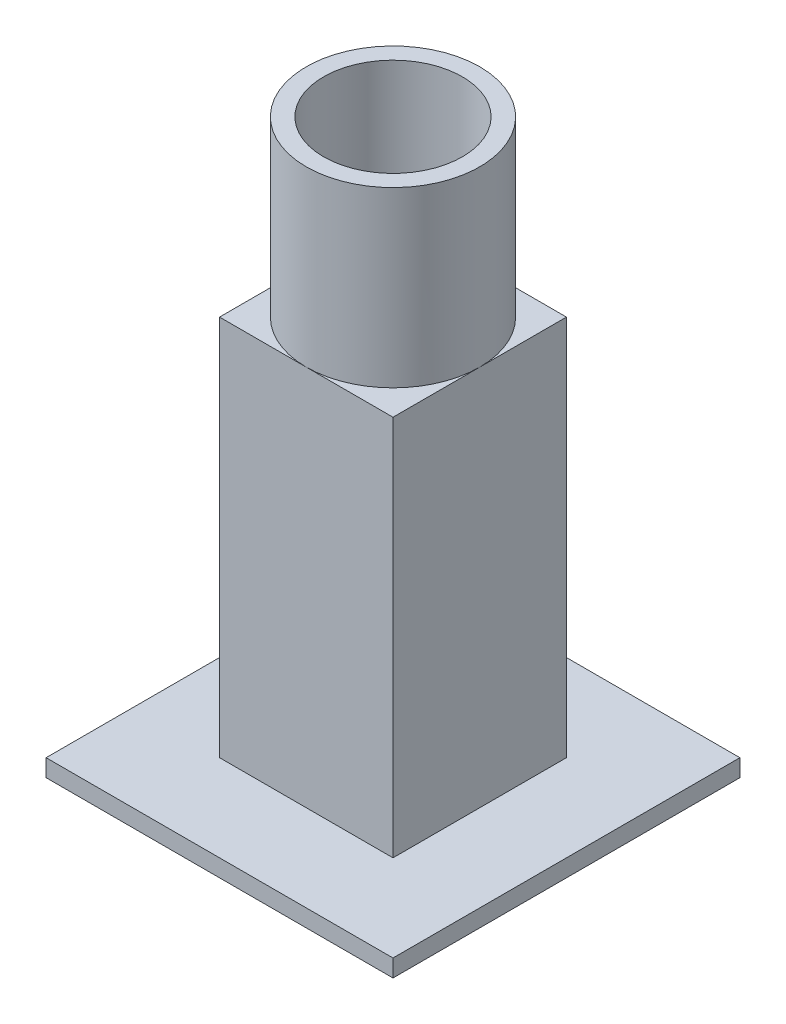
ISO-10303-21;
HEADER;
FILE_DESCRIPTION(('STEP AP214'),'2;1');
FILE_NAME('part.step','',(''),(''),'','','');
FILE_SCHEMA(('AUTOMOTIVE_DESIGN { 1 0 10303 214 1 1 1 1 }'));
ENDSEC;
DATA;
#1=APPLICATION_CONTEXT('core data for automotive mechanical design processes');
#2=APPLICATION_PROTOCOL_DEFINITION('international standard','automotive_design',2000,#1);
#3=PRODUCT_CONTEXT('',#1,'mechanical');
#4=PRODUCT('Part','Part','',(#3));
#5=PRODUCT_RELATED_PRODUCT_CATEGORY('part','',(#4));
#6=PRODUCT_DEFINITION_FORMATION('','',#4);
#7=PRODUCT_DEFINITION_CONTEXT('part definition',#1,'design');
#8=PRODUCT_DEFINITION('design','',#6,#7);
#9=PRODUCT_DEFINITION_SHAPE('','',#8);
#10=(LENGTH_UNIT() NAMED_UNIT(*) SI_UNIT(.MILLI.,.METRE.));
#11=(NAMED_UNIT(*) PLANE_ANGLE_UNIT() SI_UNIT($,.RADIAN.));
#12=(NAMED_UNIT(*) SI_UNIT($,.STERADIAN.) SOLID_ANGLE_UNIT());
#13=UNCERTAINTY_MEASURE_WITH_UNIT(LENGTH_MEASURE(1.E-05),#10,'distance_accuracy_value','');
#14=(GEOMETRIC_REPRESENTATION_CONTEXT(3) GLOBAL_UNCERTAINTY_ASSIGNED_CONTEXT((#13)) GLOBAL_UNIT_ASSIGNED_CONTEXT((#10,
#11,#12)) REPRESENTATION_CONTEXT('',''));
#15=CARTESIAN_POINT('',(0.,0.,0.));
#16=DIRECTION('',(0.,0.,1.));
#17=DIRECTION('',(1.,0.,0.));
#18=AXIS2_PLACEMENT_3D('',#15,#16,#17);
#19=CARTESIAN_POINT('',(0.,230.,0.));
#20=DIRECTION('',(0.,1.,0.));
#21=DIRECTION('',(0.,0.,1.));
#22=AXIS2_PLACEMENT_3D('',#19,#20,#21);
#23=PLANE('',#22);
#24=CARTESIAN_POINT('',(100.,230.,-100.));
#25=DIRECTION('',(0.,1.,0.));
#26=DIRECTION('',(0.,0.,1.));
#27=AXIS2_PLACEMENT_3D('',#24,#25,#26);
#28=CIRCLE('',#27,50.);
#29=CARTESIAN_POINT('',(100.,230.,-50.));
#30=VERTEX_POINT('',#29);
#31=CARTESIAN_POINT('',(150.,230.,-100.));
#32=VERTEX_POINT('',#31);
#33=EDGE_CURVE('E51',#30,#32,#28,.T.);
#34=ORIENTED_EDGE('',*,*,#33,.F.);
#35=DIRECTION('',(1.,0.,0.));
#36=VECTOR('',#35,1.);
#37=CARTESIAN_POINT('',(50.,230.,-50.));
#38=LINE('',#37,#36);
#39=CARTESIAN_POINT('',(150.,230.,-50.));
#40=VERTEX_POINT('',#39);
#41=EDGE_CURVE('E130',#30,#40,#38,.T.);
#42=ORIENTED_EDGE('',*,*,#41,.T.);
#43=DIRECTION('',(0.,0.,-1.));
#44=VECTOR('',#43,1.);
#45=CARTESIAN_POINT('',(150.,230.,-150.));
#46=LINE('',#45,#44);
#47=EDGE_CURVE('E144',#40,#32,#46,.T.);
#48=ORIENTED_EDGE('',*,*,#47,.T.);
#49=EDGE_LOOP('',(#34,#42,#48));
#50=FACE_BOUND('',#49,.T.);
#51=ADVANCED_FACE('F39',(#50),#23,.T.);
#52=CARTESIAN_POINT('',(100.,230.,-150.));
#53=VERTEX_POINT('',#52);
#54=EDGE_CURVE('E11',#32,#53,#28,.T.);
#55=ORIENTED_EDGE('',*,*,#54,.F.);
#56=CARTESIAN_POINT('',(150.,230.,-150.));
#57=VERTEX_POINT('',#56);
#58=EDGE_CURVE('E129',#32,#57,#46,.T.);
#59=ORIENTED_EDGE('',*,*,#58,.T.);
#60=DIRECTION('',(-1.,0.,0.));
#61=VECTOR('',#60,1.);
#62=CARTESIAN_POINT('',(50.,230.,-150.));
#63=LINE('',#62,#61);
#64=EDGE_CURVE('E168',#57,#53,#63,.T.);
#65=ORIENTED_EDGE('',*,*,#64,.T.);
#66=EDGE_LOOP('',(#55,#59,#65));
#67=FACE_BOUND('',#66,.T.);
#68=ADVANCED_FACE('F262',(#67),#23,.T.);
#69=CARTESIAN_POINT('',(50.,230.,-100.));
#70=VERTEX_POINT('',#69);
#71=EDGE_CURVE('E49',#53,#70,#28,.T.);
#72=ORIENTED_EDGE('',*,*,#71,.F.);
#73=CARTESIAN_POINT('',(50.,230.,-150.));
#74=VERTEX_POINT('',#73);
#75=EDGE_CURVE('E167',#53,#74,#63,.T.);
#76=ORIENTED_EDGE('',*,*,#75,.T.);
#77=DIRECTION('',(0.,0.,1.));
#78=VECTOR('',#77,1.);
#79=CARTESIAN_POINT('',(50.,230.,-150.));
#80=LINE('',#79,#78);
#81=EDGE_CURVE('E142',#74,#70,#80,.T.);
#82=ORIENTED_EDGE('',*,*,#81,.T.);
#83=EDGE_LOOP('',(#72,#76,#82));
#84=FACE_BOUND('',#83,.T.);
#85=ADVANCED_FACE('F260',(#84),#23,.T.);
#86=CARTESIAN_POINT('',(0.,10.,0.));
#87=DIRECTION('',(1.,0.,0.));
#88=DIRECTION('',(0.,0.,-1.));
#89=AXIS2_PLACEMENT_3D('',#86,#87,#88);
#90=PLANE('',#89);
#91=DIRECTION('',(0.,0.,1.));
#92=VECTOR('',#91,1.);
#93=CARTESIAN_POINT('',(0.,0.,0.));
#94=LINE('',#93,#92);
#95=CARTESIAN_POINT('',(0.,0.,-200.));
#96=VERTEX_POINT('',#95);
#97=CARTESIAN_POINT('',(0.,0.,0.));
#98=VERTEX_POINT('',#97);
#99=EDGE_CURVE('E198',#96,#98,#94,.T.);
#100=ORIENTED_EDGE('',*,*,#99,.T.);
#101=DIRECTION('',(0.,-1.,0.));
#102=VECTOR('',#101,1.);
#103=CARTESIAN_POINT('',(0.,10.,0.));
#104=LINE('',#103,#102);
#105=CARTESIAN_POINT('',(0.,10.,0.));
#106=VERTEX_POINT('',#105);
#107=EDGE_CURVE('E43',#106,#98,#104,.T.);
#108=ORIENTED_EDGE('',*,*,#107,.F.);
#109=DIRECTION('',(0.,0.,1.));
#110=VECTOR('',#109,1.);
#111=CARTESIAN_POINT('',(0.,10.,0.));
#112=LINE('',#111,#110);
#113=CARTESIAN_POINT('',(0.,10.,-200.));
#114=VERTEX_POINT('',#113);
#115=EDGE_CURVE('E199',#114,#106,#112,.T.);
#116=ORIENTED_EDGE('',*,*,#115,.F.);
#117=DIRECTION('',(0.,-1.,0.));
#118=VECTOR('',#117,1.);
#119=CARTESIAN_POINT('',(0.,10.,-200.));
#120=LINE('',#119,#118);
#121=EDGE_CURVE('E213',#114,#96,#120,.T.);
#122=ORIENTED_EDGE('',*,*,#121,.T.);
#123=EDGE_LOOP('',(#100,#108,#116,#122));
#124=FACE_BOUND('',#123,.T.);
#125=ADVANCED_FACE('F41',(#124),#90,.F.);
#126=CARTESIAN_POINT('',(0.,10.,0.));
#127=DIRECTION('',(0.,0.,-1.));
#128=DIRECTION('',(-1.,0.,0.));
#129=AXIS2_PLACEMENT_3D('',#126,#127,#128);
#130=PLANE('',#129);
#131=DIRECTION('',(1.,0.,0.));
#132=VECTOR('',#131,1.);
#133=CARTESIAN_POINT('',(0.,0.,0.));
#134=LINE('',#133,#132);
#135=CARTESIAN_POINT('',(200.,0.,0.));
#136=VERTEX_POINT('',#135);
#137=EDGE_CURVE('E217',#98,#136,#134,.T.);
#138=ORIENTED_EDGE('',*,*,#137,.T.);
#139=DIRECTION('',(0.,-1.,0.));
#140=VECTOR('',#139,1.);
#141=CARTESIAN_POINT('',(200.,10.,0.));
#142=LINE('',#141,#140);
#143=CARTESIAN_POINT('',(200.,10.,0.));
#144=VERTEX_POINT('',#143);
#145=EDGE_CURVE('E154',#144,#136,#142,.T.);
#146=ORIENTED_EDGE('',*,*,#145,.F.);
#147=DIRECTION('',(1.,0.,0.));
#148=VECTOR('',#147,1.);
#149=CARTESIAN_POINT('',(0.,10.,0.));
#150=LINE('',#149,#148);
#151=EDGE_CURVE('E203',#106,#144,#150,.T.);
#152=ORIENTED_EDGE('',*,*,#151,.F.);
#153=ORIENTED_EDGE('',*,*,#107,.T.);
#154=EDGE_LOOP('',(#138,#146,#152,#153));
#155=FACE_BOUND('',#154,.T.);
#156=ADVANCED_FACE('F253',(#155),#130,.F.);
#157=CARTESIAN_POINT('',(200.,10.,0.));
#158=DIRECTION('',(-1.,0.,0.));
#159=DIRECTION('',(0.,0.,1.));
#160=AXIS2_PLACEMENT_3D('',#157,#158,#159);
#161=PLANE('',#160);
#162=DIRECTION('',(0.,0.,-1.));
#163=VECTOR('',#162,1.);
#164=CARTESIAN_POINT('',(200.,0.,0.));
#165=LINE('',#164,#163);
#166=CARTESIAN_POINT('',(200.,0.,-200.));
#167=VERTEX_POINT('',#166);
#168=EDGE_CURVE('E220',#136,#167,#165,.T.);
#169=ORIENTED_EDGE('',*,*,#168,.T.);
#170=DIRECTION('',(0.,-1.,0.));
#171=VECTOR('',#170,1.);
#172=CARTESIAN_POINT('',(200.,10.,-200.));
#173=LINE('',#172,#171);
#174=CARTESIAN_POINT('',(200.,10.,-200.));
#175=VERTEX_POINT('',#174);
#176=EDGE_CURVE('E228',#175,#167,#173,.T.);
#177=ORIENTED_EDGE('',*,*,#176,.F.);
#178=DIRECTION('',(0.,0.,-1.));
#179=VECTOR('',#178,1.);
#180=CARTESIAN_POINT('',(200.,10.,0.));
#181=LINE('',#180,#179);
#182=EDGE_CURVE('E207',#144,#175,#181,.T.);
#183=ORIENTED_EDGE('',*,*,#182,.F.);
#184=ORIENTED_EDGE('',*,*,#145,.T.);
#185=EDGE_LOOP('',(#169,#177,#183,#184));
#186=FACE_BOUND('',#185,.T.);
#187=ADVANCED_FACE('F237',(#186),#161,.F.);
#188=CARTESIAN_POINT('',(0.,10.,-200.));
#189=DIRECTION('',(0.,0.,1.));
#190=DIRECTION('',(1.,0.,0.));
#191=AXIS2_PLACEMENT_3D('',#188,#189,#190);
#192=PLANE('',#191);
#193=DIRECTION('',(-1.,0.,0.));
#194=VECTOR('',#193,1.);
#195=CARTESIAN_POINT('',(0.,0.,-200.));
#196=LINE('',#195,#194);
#197=EDGE_CURVE('E204',#167,#96,#196,.T.);
#198=ORIENTED_EDGE('',*,*,#197,.T.);
#199=ORIENTED_EDGE('',*,*,#121,.F.);
#200=DIRECTION('',(-1.,0.,0.));
#201=VECTOR('',#200,1.);
#202=CARTESIAN_POINT('',(0.,10.,-200.));
#203=LINE('',#202,#201);
#204=EDGE_CURVE('E210',#175,#114,#203,.T.);
#205=ORIENTED_EDGE('',*,*,#204,.F.);
#206=ORIENTED_EDGE('',*,*,#176,.T.);
#207=EDGE_LOOP('',(#198,#199,#205,#206));
#208=FACE_BOUND('',#207,.T.);
#209=ADVANCED_FACE('F246',(#208),#192,.F.);
#210=CARTESIAN_POINT('',(0.,10.,0.));
#211=DIRECTION('',(0.,-1.,0.));
#212=DIRECTION('',(0.,0.,-1.));
#213=AXIS2_PLACEMENT_3D('',#210,#211,#212);
#214=PLANE('',#213);
#215=DIRECTION('',(0.,0.,1.));
#216=VECTOR('',#215,1.);
#217=CARTESIAN_POINT('',(50.,10.,-150.));
#218=LINE('',#217,#216);
#219=CARTESIAN_POINT('',(50.,10.,-150.));
#220=VERTEX_POINT('',#219);
#221=CARTESIAN_POINT('',(50.,10.,-50.));
#222=VERTEX_POINT('',#221);
#223=EDGE_CURVE('E162',#220,#222,#218,.T.);
#224=ORIENTED_EDGE('',*,*,#223,.F.);
#225=DIRECTION('',(-1.,0.,0.));
#226=VECTOR('',#225,1.);
#227=CARTESIAN_POINT('',(50.,10.,-150.));
#228=LINE('',#227,#226);
#229=CARTESIAN_POINT('',(150.,10.,-150.));
#230=VERTEX_POINT('',#229);
#231=EDGE_CURVE('E182',#230,#220,#228,.T.);
#232=ORIENTED_EDGE('',*,*,#231,.F.);
#233=DIRECTION('',(0.,0.,-1.));
#234=VECTOR('',#233,1.);
#235=CARTESIAN_POINT('',(150.,10.,-150.));
#236=LINE('',#235,#234);
#237=CARTESIAN_POINT('',(150.,10.,-50.));
#238=VERTEX_POINT('',#237);
#239=EDGE_CURVE('E178',#238,#230,#236,.T.);
#240=ORIENTED_EDGE('',*,*,#239,.F.);
#241=DIRECTION('',(1.,0.,0.));
#242=VECTOR('',#241,1.);
#243=CARTESIAN_POINT('',(50.,10.,-50.));
#244=LINE('',#243,#242);
#245=EDGE_CURVE('E175',#222,#238,#244,.T.);
#246=ORIENTED_EDGE('',*,*,#245,.F.);
#247=EDGE_LOOP('',(#224,#232,#240,#246));
#248=FACE_BOUND('',#247,.T.);
#249=ORIENTED_EDGE('',*,*,#115,.T.);
#250=ORIENTED_EDGE('',*,*,#151,.T.);
#251=ORIENTED_EDGE('',*,*,#182,.T.);
#252=ORIENTED_EDGE('',*,*,#204,.T.);
#253=EDGE_LOOP('',(#249,#250,#251,#252));
#254=FACE_BOUND('',#253,.T.);
#255=ADVANCED_FACE('F252',(#248,#254),#214,.F.);
#256=CARTESIAN_POINT('',(0.,0.,0.));
#257=DIRECTION('',(0.,-1.,0.));
#258=DIRECTION('',(0.,0.,-1.));
#259=AXIS2_PLACEMENT_3D('',#256,#257,#258);
#260=PLANE('',#259);
#261=ORIENTED_EDGE('',*,*,#99,.F.);
#262=ORIENTED_EDGE('',*,*,#197,.F.);
#263=ORIENTED_EDGE('',*,*,#168,.F.);
#264=ORIENTED_EDGE('',*,*,#137,.F.);
#265=EDGE_LOOP('',(#261,#262,#263,#264));
#266=FACE_BOUND('',#265,.T.);
#267=ADVANCED_FACE('F243',(#266),#260,.T.);
#268=EDGE_CURVE('E122',#70,#30,#28,.T.);
#269=ORIENTED_EDGE('',*,*,#268,.F.);
#270=CARTESIAN_POINT('',(50.,230.,-50.));
#271=VERTEX_POINT('',#270);
#272=EDGE_CURVE('E124',#70,#271,#80,.T.);
#273=ORIENTED_EDGE('',*,*,#272,.T.);
#274=EDGE_CURVE('E118',#271,#30,#38,.T.);
#275=ORIENTED_EDGE('',*,*,#274,.T.);
#276=EDGE_LOOP('',(#269,#273,#275));
#277=FACE_BOUND('',#276,.T.);
#278=ADVANCED_FACE('F120',(#277),#23,.T.);
#279=CARTESIAN_POINT('',(50.,230.,-150.));
#280=DIRECTION('',(1.,0.,0.));
#281=DIRECTION('',(0.,0.,-1.));
#282=AXIS2_PLACEMENT_3D('',#279,#280,#281);
#283=PLANE('',#282);
#284=ORIENTED_EDGE('',*,*,#223,.T.);
#285=DIRECTION('',(0.,-1.,0.));
#286=VECTOR('',#285,1.);
#287=CARTESIAN_POINT('',(50.,230.,-50.));
#288=LINE('',#287,#286);
#289=EDGE_CURVE('E195',#271,#222,#288,.T.);
#290=ORIENTED_EDGE('',*,*,#289,.F.);
#291=ORIENTED_EDGE('',*,*,#272,.F.);
#292=ORIENTED_EDGE('',*,*,#81,.F.);
#293=DIRECTION('',(0.,-1.,0.));
#294=VECTOR('',#293,1.);
#295=CARTESIAN_POINT('',(50.,230.,-150.));
#296=LINE('',#295,#294);
#297=EDGE_CURVE('E171',#74,#220,#296,.T.);
#298=ORIENTED_EDGE('',*,*,#297,.T.);
#299=EDGE_LOOP('',(#284,#290,#291,#292,#298));
#300=FACE_BOUND('',#299,.T.);
#301=ADVANCED_FACE('F270',(#300),#283,.F.);
#302=CARTESIAN_POINT('',(50.,230.,-50.));
#303=DIRECTION('',(0.,0.,-1.));
#304=DIRECTION('',(-1.,0.,0.));
#305=AXIS2_PLACEMENT_3D('',#302,#303,#304);
#306=PLANE('',#305);
#307=ORIENTED_EDGE('',*,*,#245,.T.);
#308=DIRECTION('',(0.,-1.,0.));
#309=VECTOR('',#308,1.);
#310=CARTESIAN_POINT('',(150.,230.,-50.));
#311=LINE('',#310,#309);
#312=EDGE_CURVE('E137',#40,#238,#311,.T.);
#313=ORIENTED_EDGE('',*,*,#312,.F.);
#314=ORIENTED_EDGE('',*,*,#41,.F.);
#315=ORIENTED_EDGE('',*,*,#274,.F.);
#316=ORIENTED_EDGE('',*,*,#289,.T.);
#317=EDGE_LOOP('',(#307,#313,#314,#315,#316));
#318=FACE_BOUND('',#317,.T.);
#319=ADVANCED_FACE('F135',(#318),#306,.F.);
#320=CARTESIAN_POINT('',(150.,230.,-150.));
#321=DIRECTION('',(-1.,0.,0.));
#322=DIRECTION('',(0.,0.,1.));
#323=AXIS2_PLACEMENT_3D('',#320,#321,#322);
#324=PLANE('',#323);
#325=ORIENTED_EDGE('',*,*,#239,.T.);
#326=DIRECTION('',(0.,-1.,0.));
#327=VECTOR('',#326,1.);
#328=CARTESIAN_POINT('',(150.,230.,-150.));
#329=LINE('',#328,#327);
#330=EDGE_CURVE('E189',#57,#230,#329,.T.);
#331=ORIENTED_EDGE('',*,*,#330,.F.);
#332=ORIENTED_EDGE('',*,*,#58,.F.);
#333=ORIENTED_EDGE('',*,*,#47,.F.);
#334=ORIENTED_EDGE('',*,*,#312,.T.);
#335=EDGE_LOOP('',(#325,#331,#332,#333,#334));
#336=FACE_BOUND('',#335,.T.);
#337=ADVANCED_FACE('F365',(#336),#324,.F.);
#338=CARTESIAN_POINT('',(50.,230.,-150.));
#339=DIRECTION('',(0.,0.,1.));
#340=DIRECTION('',(1.,0.,0.));
#341=AXIS2_PLACEMENT_3D('',#338,#339,#340);
#342=PLANE('',#341);
#343=ORIENTED_EDGE('',*,*,#231,.T.);
#344=ORIENTED_EDGE('',*,*,#297,.F.);
#345=ORIENTED_EDGE('',*,*,#75,.F.);
#346=ORIENTED_EDGE('',*,*,#64,.F.);
#347=ORIENTED_EDGE('',*,*,#330,.T.);
#348=EDGE_LOOP('',(#343,#344,#345,#346,#347));
#349=FACE_BOUND('',#348,.T.);
#350=ADVANCED_FACE('F358',(#349),#342,.F.);
#351=CARTESIAN_POINT('',(100.,330.,-100.));
#352=DIRECTION('',(0.,1.,0.));
#353=DIRECTION('',(0.,0.,1.));
#354=AXIS2_PLACEMENT_3D('',#351,#352,#353);
#355=PLANE('',#354);
#356=CARTESIAN_POINT('',(100.,330.,-100.));
#357=DIRECTION('',(0.,1.,0.));
#358=DIRECTION('',(0.,0.,1.));
#359=AXIS2_PLACEMENT_3D('',#356,#357,#358);
#360=CIRCLE('',#359,50.);
#361=CARTESIAN_POINT('',(100.,330.,-50.));
#362=VERTEX_POINT('',#361);
#363=EDGE_CURVE('E147',#362,#362,#360,.T.);
#364=ORIENTED_EDGE('',*,*,#363,.T.);
#365=EDGE_LOOP('',(#364));
#366=FACE_BOUND('',#365,.T.);
#367=CARTESIAN_POINT('',(100.,330.,-100.));
#368=DIRECTION('',(0.,1.,0.));
#369=DIRECTION('',(0.,0.,1.));
#370=AXIS2_PLACEMENT_3D('',#367,#368,#369);
#371=CIRCLE('',#370,40.);
#372=CARTESIAN_POINT('',(100.,330.,-60.));
#373=VERTEX_POINT('',#372);
#374=EDGE_CURVE('E148',#373,#373,#371,.T.);
#375=ORIENTED_EDGE('',*,*,#374,.F.);
#376=EDGE_LOOP('',(#375));
#377=FACE_BOUND('',#376,.T.);
#378=ADVANCED_FACE('F364',(#366,#377),#355,.T.);
#379=CARTESIAN_POINT('',(100.,330.,-100.));
#380=DIRECTION('',(0.,-1.,0.));
#381=DIRECTION('',(0.,0.,-1.));
#382=AXIS2_PLACEMENT_3D('',#379,#380,#381);
#383=CYLINDRICAL_SURFACE('',#382,50.);
#384=ORIENTED_EDGE('',*,*,#363,.F.);
#385=EDGE_LOOP('',(#384));
#386=FACE_BOUND('',#385,.T.);
#387=ORIENTED_EDGE('',*,*,#33,.T.);
#388=ORIENTED_EDGE('',*,*,#54,.T.);
#389=ORIENTED_EDGE('',*,*,#71,.T.);
#390=ORIENTED_EDGE('',*,*,#268,.T.);
#391=EDGE_LOOP('',(#387,#388,#389,#390));
#392=FACE_BOUND('',#391,.T.);
#393=ADVANCED_FACE('F149',(#386,#392),#383,.T.);
#394=CARTESIAN_POINT('',(100.,10.,-100.));
#395=DIRECTION('',(0.,1.,0.));
#396=DIRECTION('',(0.,0.,1.));
#397=AXIS2_PLACEMENT_3D('',#394,#395,#396);
#398=CIRCLE('',#397,40.);
#399=CARTESIAN_POINT('',(100.,10.,-60.));
#400=VERTEX_POINT('',#399);
#401=EDGE_CURVE('E158',#400,#400,#398,.T.);
#402=ORIENTED_EDGE('',*,*,#401,.T.);
#403=EDGE_LOOP('',(#402));
#404=FACE_BOUND('',#403,.T.);
#405=ADVANCED_FACE('F323',(#404),#214,.F.);
#406=CARTESIAN_POINT('',(100.,230.,-100.));
#407=DIRECTION('',(0.,-1.,0.));
#408=DIRECTION('',(0.,0.,-1.));
#409=AXIS2_PLACEMENT_3D('',#406,#407,#408);
#410=CYLINDRICAL_SURFACE('',#409,40.);
#411=ORIENTED_EDGE('',*,*,#401,.F.);
#412=EDGE_LOOP('',(#411));
#413=FACE_BOUND('',#412,.T.);
#414=ORIENTED_EDGE('',*,*,#374,.T.);
#415=EDGE_LOOP('',(#414));
#416=FACE_BOUND('',#415,.T.);
#417=ADVANCED_FACE('F329',(#413,#416),#410,.F.);
#418=CLOSED_SHELL('',(#51,#68,#85,#125,#156,#187,#209,#255,#267,#278,#301,#319,#337,#350,#378,
#393,#405,#417));
#419=MANIFOLD_SOLID_BREP('B2',#418);
#420=ADVANCED_BREP_SHAPE_REPRESENTATION('',(#18,#419),#14);
#421=SHAPE_DEFINITION_REPRESENTATION(#9,#420);
ENDSEC;
END-ISO-10303-21;
